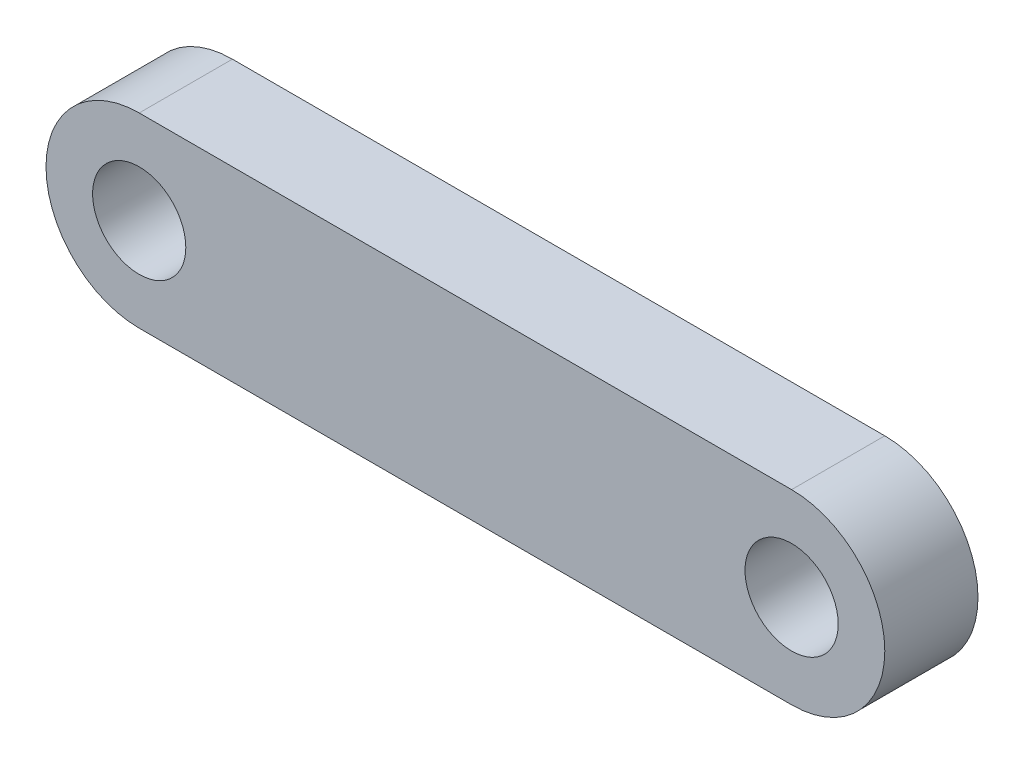
ISO-10303-21;
HEADER;
FILE_DESCRIPTION(('STEP AP214'),'2;1');
FILE_NAME('part.step','',(''),(''),'','','');
FILE_SCHEMA(('AUTOMOTIVE_DESIGN { 1 0 10303 214 1 1 1 1 }'));
ENDSEC;
DATA;
#1=APPLICATION_CONTEXT('core data for automotive mechanical design processes');
#2=APPLICATION_PROTOCOL_DEFINITION('international standard','automotive_design',2000,#1);
#3=PRODUCT_CONTEXT('',#1,'mechanical');
#4=PRODUCT('Part','Part','',(#3));
#5=PRODUCT_RELATED_PRODUCT_CATEGORY('part','',(#4));
#6=PRODUCT_DEFINITION_FORMATION('','',#4);
#7=PRODUCT_DEFINITION_CONTEXT('part definition',#1,'design');
#8=PRODUCT_DEFINITION('design','',#6,#7);
#9=PRODUCT_DEFINITION_SHAPE('','',#8);
#10=(LENGTH_UNIT() NAMED_UNIT(*) SI_UNIT(.MILLI.,.METRE.));
#11=(NAMED_UNIT(*) PLANE_ANGLE_UNIT() SI_UNIT($,.RADIAN.));
#12=(NAMED_UNIT(*) SI_UNIT($,.STERADIAN.) SOLID_ANGLE_UNIT());
#13=UNCERTAINTY_MEASURE_WITH_UNIT(LENGTH_MEASURE(1.E-05),#10,'distance_accuracy_value','');
#14=(GEOMETRIC_REPRESENTATION_CONTEXT(3) GLOBAL_UNCERTAINTY_ASSIGNED_CONTEXT((#13)) GLOBAL_UNIT_ASSIGNED_CONTEXT((#10,
#11,#12)) REPRESENTATION_CONTEXT('',''));
#15=CARTESIAN_POINT('',(0.,0.,0.));
#16=DIRECTION('',(0.,0.,1.));
#17=DIRECTION('',(1.,0.,0.));
#18=AXIS2_PLACEMENT_3D('',#15,#16,#17);
#19=CARTESIAN_POINT('',(0.,0.,50.));
#20=DIRECTION('',(0.,0.,1.));
#21=DIRECTION('',(1.,0.,0.));
#22=AXIS2_PLACEMENT_3D('',#19,#20,#21);
#23=PLANE('',#22);
#24=CARTESIAN_POINT('',(0.,0.,50.));
#25=DIRECTION('',(0.,0.,1.));
#26=DIRECTION('',(1.,0.,0.));
#27=AXIS2_PLACEMENT_3D('',#24,#25,#26);
#28=CIRCLE('',#27,25.);
#29=CARTESIAN_POINT('',(25.,0.,50.));
#30=VERTEX_POINT('',#29);
#31=EDGE_CURVE('E104',#30,#30,#28,.T.);
#32=ORIENTED_EDGE('',*,*,#31,.F.);
#33=EDGE_LOOP('',(#32));
#34=FACE_BOUND('',#33,.T.);
#35=CARTESIAN_POINT('',(0.,0.,50.));
#36=DIRECTION('',(0.,0.,1.));
#37=DIRECTION('',(1.,0.,0.));
#38=AXIS2_PLACEMENT_3D('',#35,#36,#37);
#39=CIRCLE('',#38,50.);
#40=CARTESIAN_POINT('',(0.,50.,50.));
#41=VERTEX_POINT('',#40);
#42=CARTESIAN_POINT('',(0.,-50.,50.));
#43=VERTEX_POINT('',#42);
#44=EDGE_CURVE('E89',#41,#43,#39,.T.);
#45=ORIENTED_EDGE('',*,*,#44,.T.);
#46=DIRECTION('',(1.,0.,0.));
#47=VECTOR('',#46,1.);
#48=CARTESIAN_POINT('',(0.,-50.,50.));
#49=LINE('',#48,#47);
#50=CARTESIAN_POINT('',(350.,-50.,50.));
#51=VERTEX_POINT('',#50);
#52=EDGE_CURVE('E84',#43,#51,#49,.T.);
#53=ORIENTED_EDGE('',*,*,#52,.T.);
#54=CARTESIAN_POINT('',(350.,0.,50.));
#55=DIRECTION('',(0.,0.,1.));
#56=DIRECTION('',(1.,0.,0.));
#57=AXIS2_PLACEMENT_3D('',#54,#55,#56);
#58=CIRCLE('',#57,50.);
#59=CARTESIAN_POINT('',(350.,50.,50.));
#60=VERTEX_POINT('',#59);
#61=EDGE_CURVE('E87',#51,#60,#58,.T.);
#62=ORIENTED_EDGE('',*,*,#61,.T.);
#63=DIRECTION('',(-1.,0.,0.));
#64=VECTOR('',#63,1.);
#65=CARTESIAN_POINT('',(0.,50.,50.));
#66=LINE('',#65,#64);
#67=EDGE_CURVE('E54',#60,#41,#66,.T.);
#68=ORIENTED_EDGE('',*,*,#67,.T.);
#69=EDGE_LOOP('',(#45,#53,#62,#68));
#70=FACE_BOUND('',#69,.T.);
#71=CARTESIAN_POINT('',(350.,0.,50.));
#72=DIRECTION('',(0.,0.,1.));
#73=DIRECTION('',(1.,0.,0.));
#74=AXIS2_PLACEMENT_3D('',#71,#72,#73);
#75=CIRCLE('',#74,25.);
#76=CARTESIAN_POINT('',(375.,0.,50.));
#77=VERTEX_POINT('',#76);
#78=EDGE_CURVE('E119',#77,#77,#75,.T.);
#79=ORIENTED_EDGE('',*,*,#78,.F.);
#80=EDGE_LOOP('',(#79));
#81=FACE_BOUND('',#80,.T.);
#82=ADVANCED_FACE('F37',(#34,#70,#81),#23,.T.);
#83=CARTESIAN_POINT('',(0.,0.,0.));
#84=DIRECTION('',(0.,0.,1.));
#85=DIRECTION('',(1.,0.,0.));
#86=AXIS2_PLACEMENT_3D('',#83,#84,#85);
#87=PLANE('',#86);
#88=CARTESIAN_POINT('',(0.,0.,0.));
#89=DIRECTION('',(0.,0.,1.));
#90=DIRECTION('',(1.,0.,0.));
#91=AXIS2_PLACEMENT_3D('',#88,#89,#90);
#92=CIRCLE('',#91,50.);
#93=CARTESIAN_POINT('',(0.,50.,0.));
#94=VERTEX_POINT('',#93);
#95=CARTESIAN_POINT('',(0.,-50.,0.));
#96=VERTEX_POINT('',#95);
#97=EDGE_CURVE('E101',#94,#96,#92,.T.);
#98=ORIENTED_EDGE('',*,*,#97,.F.);
#99=DIRECTION('',(-1.,0.,0.));
#100=VECTOR('',#99,1.);
#101=CARTESIAN_POINT('',(0.,50.,0.));
#102=LINE('',#101,#100);
#103=CARTESIAN_POINT('',(350.,50.,0.));
#104=VERTEX_POINT('',#103);
#105=EDGE_CURVE('E77',#104,#94,#102,.T.);
#106=ORIENTED_EDGE('',*,*,#105,.F.);
#107=CARTESIAN_POINT('',(350.,0.,0.));
#108=DIRECTION('',(0.,0.,1.));
#109=DIRECTION('',(1.,0.,0.));
#110=AXIS2_PLACEMENT_3D('',#107,#108,#109);
#111=CIRCLE('',#110,50.);
#112=CARTESIAN_POINT('',(350.,-50.,0.));
#113=VERTEX_POINT('',#112);
#114=EDGE_CURVE('E71',#113,#104,#111,.T.);
#115=ORIENTED_EDGE('',*,*,#114,.F.);
#116=DIRECTION('',(1.,0.,0.));
#117=VECTOR('',#116,1.);
#118=CARTESIAN_POINT('',(0.,-50.,0.));
#119=LINE('',#118,#117);
#120=EDGE_CURVE('E93',#96,#113,#119,.T.);
#121=ORIENTED_EDGE('',*,*,#120,.F.);
#122=EDGE_LOOP('',(#98,#106,#115,#121));
#123=FACE_BOUND('',#122,.T.);
#124=CARTESIAN_POINT('',(0.,0.,0.));
#125=DIRECTION('',(0.,0.,1.));
#126=DIRECTION('',(1.,0.,0.));
#127=AXIS2_PLACEMENT_3D('',#124,#125,#126);
#128=CIRCLE('',#127,25.);
#129=CARTESIAN_POINT('',(25.,0.,0.));
#130=VERTEX_POINT('',#129);
#131=EDGE_CURVE('E116',#130,#130,#128,.T.);
#132=ORIENTED_EDGE('',*,*,#131,.T.);
#133=EDGE_LOOP('',(#132));
#134=FACE_BOUND('',#133,.T.);
#135=CARTESIAN_POINT('',(350.,0.,0.));
#136=DIRECTION('',(0.,0.,1.));
#137=DIRECTION('',(1.,0.,0.));
#138=AXIS2_PLACEMENT_3D('',#135,#136,#137);
#139=CIRCLE('',#138,25.);
#140=CARTESIAN_POINT('',(375.,0.,0.));
#141=VERTEX_POINT('',#140);
#142=EDGE_CURVE('E122',#141,#141,#139,.T.);
#143=ORIENTED_EDGE('',*,*,#142,.T.);
#144=EDGE_LOOP('',(#143));
#145=FACE_BOUND('',#144,.T.);
#146=ADVANCED_FACE('F112',(#123,#134,#145),#87,.F.);
#147=CARTESIAN_POINT('',(0.,0.,50.));
#148=DIRECTION('',(0.,0.,-1.));
#149=DIRECTION('',(-1.,0.,0.));
#150=AXIS2_PLACEMENT_3D('',#147,#148,#149);
#151=CYLINDRICAL_SURFACE('',#150,50.);
#152=ORIENTED_EDGE('',*,*,#97,.T.);
#153=DIRECTION('',(0.,0.,-1.));
#154=VECTOR('',#153,1.);
#155=CARTESIAN_POINT('',(0.,-50.,50.));
#156=LINE('',#155,#154);
#157=EDGE_CURVE('E11',#43,#96,#156,.T.);
#158=ORIENTED_EDGE('',*,*,#157,.F.);
#159=ORIENTED_EDGE('',*,*,#44,.F.);
#160=DIRECTION('',(0.,0.,-1.));
#161=VECTOR('',#160,1.);
#162=CARTESIAN_POINT('',(0.,50.,50.));
#163=LINE('',#162,#161);
#164=EDGE_CURVE('E97',#41,#94,#163,.T.);
#165=ORIENTED_EDGE('',*,*,#164,.T.);
#166=EDGE_LOOP('',(#152,#158,#159,#165));
#167=FACE_BOUND('',#166,.T.);
#168=ADVANCED_FACE('F39',(#167),#151,.T.);
#169=CARTESIAN_POINT('',(0.,-50.,50.));
#170=DIRECTION('',(0.,1.,0.));
#171=DIRECTION('',(0.,0.,1.));
#172=AXIS2_PLACEMENT_3D('',#169,#170,#171);
#173=PLANE('',#172);
#174=ORIENTED_EDGE('',*,*,#120,.T.);
#175=DIRECTION('',(0.,0.,-1.));
#176=VECTOR('',#175,1.);
#177=CARTESIAN_POINT('',(350.,-50.,50.));
#178=LINE('',#177,#176);
#179=EDGE_CURVE('E46',#51,#113,#178,.T.);
#180=ORIENTED_EDGE('',*,*,#179,.F.);
#181=ORIENTED_EDGE('',*,*,#52,.F.);
#182=ORIENTED_EDGE('',*,*,#157,.T.);
#183=EDGE_LOOP('',(#174,#180,#181,#182));
#184=FACE_BOUND('',#183,.T.);
#185=ADVANCED_FACE('F92',(#184),#173,.F.);
#186=CARTESIAN_POINT('',(350.,0.,50.));
#187=DIRECTION('',(0.,0.,-1.));
#188=DIRECTION('',(-1.,0.,0.));
#189=AXIS2_PLACEMENT_3D('',#186,#187,#188);
#190=CYLINDRICAL_SURFACE('',#189,50.);
#191=ORIENTED_EDGE('',*,*,#114,.T.);
#192=DIRECTION('',(0.,0.,-1.));
#193=VECTOR('',#192,1.);
#194=CARTESIAN_POINT('',(350.,50.,50.));
#195=LINE('',#194,#193);
#196=EDGE_CURVE('E94',#60,#104,#195,.T.);
#197=ORIENTED_EDGE('',*,*,#196,.F.);
#198=ORIENTED_EDGE('',*,*,#61,.F.);
#199=ORIENTED_EDGE('',*,*,#179,.T.);
#200=EDGE_LOOP('',(#191,#197,#198,#199));
#201=FACE_BOUND('',#200,.T.);
#202=ADVANCED_FACE('F95',(#201),#190,.T.);
#203=CARTESIAN_POINT('',(0.,50.,50.));
#204=DIRECTION('',(0.,-1.,0.));
#205=DIRECTION('',(0.,0.,-1.));
#206=AXIS2_PLACEMENT_3D('',#203,#204,#205);
#207=PLANE('',#206);
#208=ORIENTED_EDGE('',*,*,#105,.T.);
#209=ORIENTED_EDGE('',*,*,#164,.F.);
#210=ORIENTED_EDGE('',*,*,#67,.F.);
#211=ORIENTED_EDGE('',*,*,#196,.T.);
#212=EDGE_LOOP('',(#208,#209,#210,#211));
#213=FACE_BOUND('',#212,.T.);
#214=ADVANCED_FACE('F109',(#213),#207,.F.);
#215=CARTESIAN_POINT('',(0.,0.,50.));
#216=DIRECTION('',(0.,0.,-1.));
#217=DIRECTION('',(-1.,0.,0.));
#218=AXIS2_PLACEMENT_3D('',#215,#216,#217);
#219=CYLINDRICAL_SURFACE('',#218,25.);
#220=ORIENTED_EDGE('',*,*,#31,.T.);
#221=EDGE_LOOP('',(#220));
#222=FACE_BOUND('',#221,.T.);
#223=ORIENTED_EDGE('',*,*,#131,.F.);
#224=EDGE_LOOP('',(#223));
#225=FACE_BOUND('',#224,.T.);
#226=ADVANCED_FACE('F139',(#222,#225),#219,.F.);
#227=CARTESIAN_POINT('',(350.,0.,50.));
#228=DIRECTION('',(0.,0.,-1.));
#229=DIRECTION('',(-1.,0.,0.));
#230=AXIS2_PLACEMENT_3D('',#227,#228,#229);
#231=CYLINDRICAL_SURFACE('',#230,25.);
#232=ORIENTED_EDGE('',*,*,#78,.T.);
#233=EDGE_LOOP('',(#232));
#234=FACE_BOUND('',#233,.T.);
#235=ORIENTED_EDGE('',*,*,#142,.F.);
#236=EDGE_LOOP('',(#235));
#237=FACE_BOUND('',#236,.T.);
#238=ADVANCED_FACE('F128',(#234,#237),#231,.F.);
#239=CLOSED_SHELL('',(#82,#146,#168,#185,#202,#214,#226,#238));
#240=MANIFOLD_SOLID_BREP('B2',#239);
#241=ADVANCED_BREP_SHAPE_REPRESENTATION('',(#18,#240),#14);
#242=SHAPE_DEFINITION_REPRESENTATION(#9,#241);
ENDSEC;
END-ISO-10303-21;
